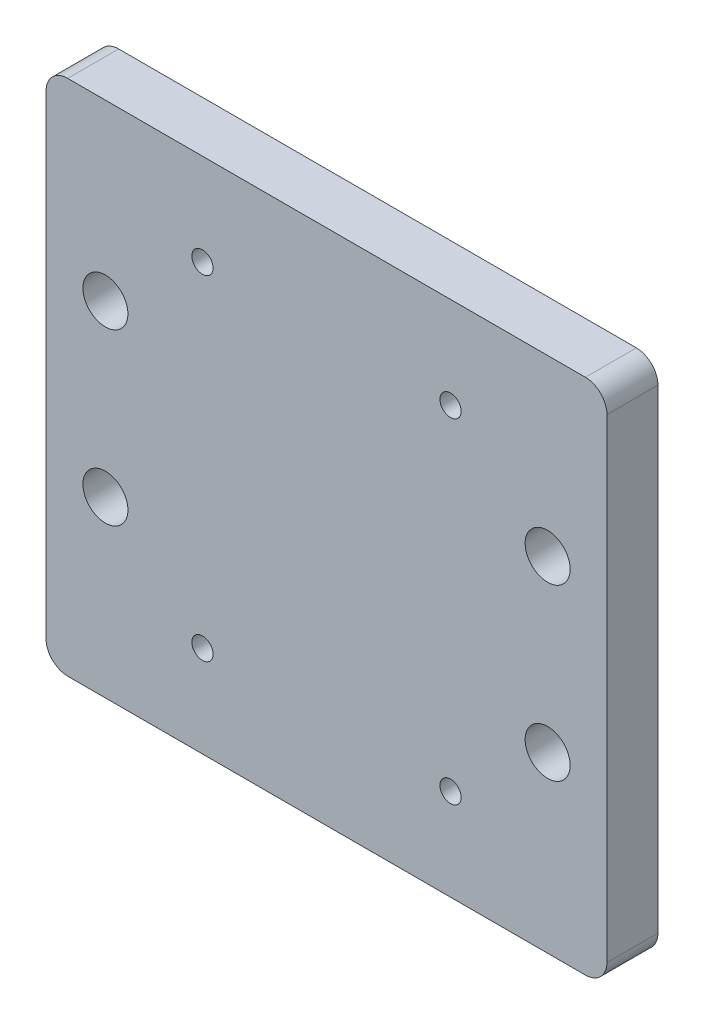
ISO-10303-21;
HEADER;
FILE_DESCRIPTION(('STEP AP214'),'2;1');
FILE_NAME('part.step','',(''),(''),'','','');
FILE_SCHEMA(('AUTOMOTIVE_DESIGN { 1 0 10303 214 1 1 1 1 }'));
ENDSEC;
DATA;
#1=APPLICATION_CONTEXT('core data for automotive mechanical design processes');
#2=APPLICATION_PROTOCOL_DEFINITION('international standard','automotive_design',2000,#1);
#3=PRODUCT_CONTEXT('',#1,'mechanical');
#4=PRODUCT('Part','Part','',(#3));
#5=PRODUCT_RELATED_PRODUCT_CATEGORY('part','',(#4));
#6=PRODUCT_DEFINITION_FORMATION('','',#4);
#7=PRODUCT_DEFINITION_CONTEXT('part definition',#1,'design');
#8=PRODUCT_DEFINITION('design','',#6,#7);
#9=PRODUCT_DEFINITION_SHAPE('','',#8);
#10=(LENGTH_UNIT() NAMED_UNIT(*) SI_UNIT(.MILLI.,.METRE.));
#11=(NAMED_UNIT(*) PLANE_ANGLE_UNIT() SI_UNIT($,.RADIAN.));
#12=(NAMED_UNIT(*) SI_UNIT($,.STERADIAN.) SOLID_ANGLE_UNIT());
#13=UNCERTAINTY_MEASURE_WITH_UNIT(LENGTH_MEASURE(1.E-05),#10,'distance_accuracy_value','');
#14=(GEOMETRIC_REPRESENTATION_CONTEXT(3) GLOBAL_UNCERTAINTY_ASSIGNED_CONTEXT((#13)) GLOBAL_UNIT_ASSIGNED_CONTEXT((#10,
#11,#12)) REPRESENTATION_CONTEXT('',''));
#15=CARTESIAN_POINT('',(0.,0.,0.));
#16=DIRECTION('',(0.,0.,1.));
#17=DIRECTION('',(1.,0.,0.));
#18=AXIS2_PLACEMENT_3D('',#15,#16,#17);
#19=CARTESIAN_POINT('',(465.1121,431.5714,-11.9999998759984));
#20=DIRECTION('',(0.,0.,1.));
#21=DIRECTION('',(0.,-1.,0.));
#22=AXIS2_PLACEMENT_3D('',#19,#20,#21);
#23=PLANE('',#22);
#24=CARTESIAN_POINT('',(469.5571,393.631400061,-11.9999998759984));
#25=DIRECTION('',(0.,0.,-1.));
#26=DIRECTION('',(-1.,0.,0.));
#27=AXIS2_PLACEMENT_3D('',#24,#25,#26);
#28=CIRCLE('',#27,2.64999999999999);
#29=CARTESIAN_POINT('',(466.9071,393.631400061,-11.9999998759984));
#30=VERTEX_POINT('',#29);
#31=EDGE_CURVE('E196',#30,#30,#28,.T.);
#32=ORIENTED_EDGE('',*,*,#31,.T.);
#33=EDGE_LOOP('',(#32));
#34=FACE_BOUND('',#33,.T.);
#35=CARTESIAN_POINT('',(469.5571,413.631399939,-11.9999998759984));
#36=DIRECTION('',(0.,0.,-1.));
#37=DIRECTION('',(-1.,0.,0.));
#38=AXIS2_PLACEMENT_3D('',#35,#36,#37);
#39=CIRCLE('',#38,2.64999999999999);
#40=CARTESIAN_POINT('',(466.9071,413.631399939,-11.9999998759984));
#41=VERTEX_POINT('',#40);
#42=EDGE_CURVE('E147',#41,#41,#39,.T.);
#43=ORIENTED_EDGE('',*,*,#42,.T.);
#44=EDGE_LOOP('',(#43));
#45=FACE_BOUND('',#44,.T.);
#46=CARTESIAN_POINT('',(465.1121,431.5714,-11.9999998759984));
#47=DIRECTION('',(0.,0.,-1.));
#48=DIRECTION('',(0.,-1.,0.));
#49=AXIS2_PLACEMENT_3D('',#46,#47,#48);
#50=CIRCLE('',#49,2.54000000000004);
#51=CARTESIAN_POINT('',(462.5721,431.5714,-11.9999998759984));
#52=VERTEX_POINT('',#51);
#53=CARTESIAN_POINT('',(465.1121,434.1114,-11.9999998759984));
#54=VERTEX_POINT('',#53);
#55=EDGE_CURVE('E143',#52,#54,#50,.T.);
#56=ORIENTED_EDGE('',*,*,#55,.F.);
#57=DIRECTION('',(0.,1.,0.));
#58=VECTOR('',#57,1.);
#59=CARTESIAN_POINT('',(462.5721,431.5714,-11.9999998759984));
#60=LINE('',#59,#58);
#61=CARTESIAN_POINT('',(462.5721,375.6914,-11.9999998759986));
#62=VERTEX_POINT('',#61);
#63=EDGE_CURVE('E97',#62,#52,#60,.T.);
#64=ORIENTED_EDGE('',*,*,#63,.F.);
#65=CARTESIAN_POINT('',(465.1121,375.6914,-11.9999998759986));
#66=DIRECTION('',(0.,0.,-1.));
#67=DIRECTION('',(0.,1.,0.));
#68=AXIS2_PLACEMENT_3D('',#65,#66,#67);
#69=CIRCLE('',#68,2.54000000000004);
#70=CARTESIAN_POINT('',(465.1121,373.1514,-11.9999998759986));
#71=VERTEX_POINT('',#70);
#72=EDGE_CURVE('E91',#71,#62,#69,.T.);
#73=ORIENTED_EDGE('',*,*,#72,.F.);
#74=DIRECTION('',(-1.,0.,0.));
#75=VECTOR('',#74,1.);
#76=CARTESIAN_POINT('',(526.0721,373.1514,-11.9999998759986));
#77=LINE('',#76,#75);
#78=CARTESIAN_POINT('',(526.0721,373.1514,-11.9999998759986));
#79=VERTEX_POINT('',#78);
#80=EDGE_CURVE('E133',#79,#71,#77,.T.);
#81=ORIENTED_EDGE('',*,*,#80,.F.);
#82=CARTESIAN_POINT('',(526.0721,375.6914,-11.9999998759986));
#83=DIRECTION('',(0.,0.,-1.));
#84=DIRECTION('',(0.,1.,0.));
#85=AXIS2_PLACEMENT_3D('',#82,#83,#84);
#86=CIRCLE('',#85,2.54000000000004);
#87=CARTESIAN_POINT('',(528.6121,375.6914,-11.9999998759986));
#88=VERTEX_POINT('',#87);
#89=EDGE_CURVE('E153',#88,#79,#86,.T.);
#90=ORIENTED_EDGE('',*,*,#89,.F.);
#91=DIRECTION('',(0.,-1.,0.));
#92=VECTOR('',#91,1.);
#93=CARTESIAN_POINT('',(528.6121,431.5714,-11.9999998759984));
#94=LINE('',#93,#92);
#95=CARTESIAN_POINT('',(528.6121,431.5714,-11.9999998759984));
#96=VERTEX_POINT('',#95);
#97=EDGE_CURVE('E151',#96,#88,#94,.T.);
#98=ORIENTED_EDGE('',*,*,#97,.F.);
#99=CARTESIAN_POINT('',(526.0721,431.5714,-11.9999998759984));
#100=DIRECTION('',(0.,0.,-1.));
#101=DIRECTION('',(0.,1.,0.));
#102=AXIS2_PLACEMENT_3D('',#99,#100,#101);
#103=CIRCLE('',#102,2.54000000000004);
#104=CARTESIAN_POINT('',(526.0721,434.1114,-11.9999998759984));
#105=VERTEX_POINT('',#104);
#106=EDGE_CURVE('E149',#105,#96,#103,.T.);
#107=ORIENTED_EDGE('',*,*,#106,.F.);
#108=DIRECTION('',(1.,0.,0.));
#109=VECTOR('',#108,1.);
#110=CARTESIAN_POINT('',(526.0721,434.1114,-11.9999998759984));
#111=LINE('',#110,#109);
#112=EDGE_CURVE('E146',#54,#105,#111,.T.);
#113=ORIENTED_EDGE('',*,*,#112,.F.);
#114=EDGE_LOOP('',(#56,#64,#73,#81,#90,#98,#107,#113));
#115=FACE_BOUND('',#114,.T.);
#116=CARTESIAN_POINT('',(521.6271,393.631400061,-11.9999998759984));
#117=DIRECTION('',(0.,0.,-1.));
#118=DIRECTION('',(-1.,0.,0.));
#119=AXIS2_PLACEMENT_3D('',#116,#117,#118);
#120=CIRCLE('',#119,2.65000000000004);
#121=CARTESIAN_POINT('',(518.9771,393.631400061,-11.9999998759984));
#122=VERTEX_POINT('',#121);
#123=EDGE_CURVE('E202',#122,#122,#120,.T.);
#124=ORIENTED_EDGE('',*,*,#123,.T.);
#125=EDGE_LOOP('',(#124));
#126=FACE_BOUND('',#125,.T.);
#127=CARTESIAN_POINT('',(521.6271,413.631399939,-11.9999998759984));
#128=DIRECTION('',(0.,0.,-1.));
#129=DIRECTION('',(-1.,0.,0.));
#130=AXIS2_PLACEMENT_3D('',#127,#128,#129);
#131=CIRCLE('',#130,2.65000000000004);
#132=CARTESIAN_POINT('',(518.9771,413.631399939,-11.9999998759984));
#133=VERTEX_POINT('',#132);
#134=EDGE_CURVE('E208',#133,#133,#131,.T.);
#135=ORIENTED_EDGE('',*,*,#134,.T.);
#136=EDGE_LOOP('',(#135));
#137=FACE_BOUND('',#136,.T.);
#138=CARTESIAN_POINT('',(510.1971,383.9464,-11.9999998759984));
#139=DIRECTION('',(0.,0.,-1.));
#140=DIRECTION('',(-1.,0.,0.));
#141=AXIS2_PLACEMENT_3D('',#138,#139,#140);
#142=CIRCLE('',#141,1.24999999999997);
#143=CARTESIAN_POINT('',(508.9471,383.9464,-11.9999998759984));
#144=VERTEX_POINT('',#143);
#145=EDGE_CURVE('E214',#144,#144,#142,.T.);
#146=ORIENTED_EDGE('',*,*,#145,.T.);
#147=EDGE_LOOP('',(#146));
#148=FACE_BOUND('',#147,.T.);
#149=CARTESIAN_POINT('',(480.9871,383.9464,-11.9999998759984));
#150=DIRECTION('',(0.,0.,-1.));
#151=DIRECTION('',(-1.,0.,0.));
#152=AXIS2_PLACEMENT_3D('',#149,#150,#151);
#153=CIRCLE('',#152,1.24999999999997);
#154=CARTESIAN_POINT('',(479.7371,383.9464,-11.9999998759984));
#155=VERTEX_POINT('',#154);
#156=EDGE_CURVE('E220',#155,#155,#153,.T.);
#157=ORIENTED_EDGE('',*,*,#156,.T.);
#158=EDGE_LOOP('',(#157));
#159=FACE_BOUND('',#158,.T.);
#160=CARTESIAN_POINT('',(480.9871,423.3164,-11.9999998759984));
#161=DIRECTION('',(0.,0.,-1.));
#162=DIRECTION('',(-1.,0.,0.));
#163=AXIS2_PLACEMENT_3D('',#160,#161,#162);
#164=CIRCLE('',#163,1.24999999999997);
#165=CARTESIAN_POINT('',(479.7371,423.3164,-11.9999998759984));
#166=VERTEX_POINT('',#165);
#167=EDGE_CURVE('E226',#166,#166,#164,.T.);
#168=ORIENTED_EDGE('',*,*,#167,.T.);
#169=EDGE_LOOP('',(#168));
#170=FACE_BOUND('',#169,.T.);
#171=CARTESIAN_POINT('',(510.1971,423.3164,-11.9999998759984));
#172=DIRECTION('',(0.,0.,-1.));
#173=DIRECTION('',(-1.,0.,0.));
#174=AXIS2_PLACEMENT_3D('',#171,#172,#173);
#175=CIRCLE('',#174,1.24999999999997);
#176=CARTESIAN_POINT('',(508.9471,423.3164,-11.9999998759984));
#177=VERTEX_POINT('',#176);
#178=EDGE_CURVE('E232',#177,#177,#175,.T.);
#179=ORIENTED_EDGE('',*,*,#178,.T.);
#180=EDGE_LOOP('',(#179));
#181=FACE_BOUND('',#180,.T.);
#182=ADVANCED_FACE('F45',(#34,#45,#115,#126,#137,#148,#159,#170,#181),#23,.T.);
#183=CARTESIAN_POINT('',(465.1121,431.5714,-17.9999998759984));
#184=DIRECTION('',(0.,0.,1.));
#185=DIRECTION('',(0.,-1.,0.));
#186=AXIS2_PLACEMENT_3D('',#183,#184,#185);
#187=PLANE('',#186);
#188=CARTESIAN_POINT('',(510.1971,423.3164,-17.999999876));
#189=DIRECTION('',(0.,0.,-1.));
#190=DIRECTION('',(-1.,0.,0.));
#191=AXIS2_PLACEMENT_3D('',#188,#189,#190);
#192=CIRCLE('',#191,1.24999999999997);
#193=CARTESIAN_POINT('',(508.9471,423.3164,-17.999999876));
#194=VERTEX_POINT('',#193);
#195=EDGE_CURVE('E235',#194,#194,#192,.T.);
#196=ORIENTED_EDGE('',*,*,#195,.F.);
#197=EDGE_LOOP('',(#196));
#198=FACE_BOUND('',#197,.T.);
#199=CARTESIAN_POINT('',(480.9871,423.3164,-17.999999876));
#200=DIRECTION('',(0.,0.,-1.));
#201=DIRECTION('',(-1.,0.,0.));
#202=AXIS2_PLACEMENT_3D('',#199,#200,#201);
#203=CIRCLE('',#202,1.24999999999997);
#204=CARTESIAN_POINT('',(479.7371,423.3164,-17.999999876));
#205=VERTEX_POINT('',#204);
#206=EDGE_CURVE('E229',#205,#205,#203,.T.);
#207=ORIENTED_EDGE('',*,*,#206,.F.);
#208=EDGE_LOOP('',(#207));
#209=FACE_BOUND('',#208,.T.);
#210=CARTESIAN_POINT('',(480.9871,383.9464,-17.999999876));
#211=DIRECTION('',(0.,0.,-1.));
#212=DIRECTION('',(-1.,0.,0.));
#213=AXIS2_PLACEMENT_3D('',#210,#211,#212);
#214=CIRCLE('',#213,1.24999999999997);
#215=CARTESIAN_POINT('',(479.7371,383.9464,-17.999999876));
#216=VERTEX_POINT('',#215);
#217=EDGE_CURVE('E223',#216,#216,#214,.T.);
#218=ORIENTED_EDGE('',*,*,#217,.F.);
#219=EDGE_LOOP('',(#218));
#220=FACE_BOUND('',#219,.T.);
#221=CARTESIAN_POINT('',(521.6271,413.631399939,-17.999999876));
#222=DIRECTION('',(0.,0.,-1.));
#223=DIRECTION('',(-1.,0.,0.));
#224=AXIS2_PLACEMENT_3D('',#221,#222,#223);
#225=CIRCLE('',#224,2.65000000000004);
#226=CARTESIAN_POINT('',(518.9771,413.631399939,-17.999999876));
#227=VERTEX_POINT('',#226);
#228=EDGE_CURVE('E211',#227,#227,#225,.T.);
#229=ORIENTED_EDGE('',*,*,#228,.F.);
#230=EDGE_LOOP('',(#229));
#231=FACE_BOUND('',#230,.T.);
#232=CARTESIAN_POINT('',(521.6271,393.631400061,-17.999999876));
#233=DIRECTION('',(0.,0.,-1.));
#234=DIRECTION('',(-1.,0.,0.));
#235=AXIS2_PLACEMENT_3D('',#232,#233,#234);
#236=CIRCLE('',#235,2.65000000000004);
#237=CARTESIAN_POINT('',(518.9771,393.631400061,-17.999999876));
#238=VERTEX_POINT('',#237);
#239=EDGE_CURVE('E205',#238,#238,#236,.T.);
#240=ORIENTED_EDGE('',*,*,#239,.F.);
#241=EDGE_LOOP('',(#240));
#242=FACE_BOUND('',#241,.T.);
#243=CARTESIAN_POINT('',(469.5571,393.631400061,-17.999999876));
#244=DIRECTION('',(0.,0.,-1.));
#245=DIRECTION('',(-1.,0.,0.));
#246=AXIS2_PLACEMENT_3D('',#243,#244,#245);
#247=CIRCLE('',#246,2.64999999999999);
#248=CARTESIAN_POINT('',(466.9071,393.631400061,-17.999999876));
#249=VERTEX_POINT('',#248);
#250=EDGE_CURVE('E199',#249,#249,#247,.T.);
#251=ORIENTED_EDGE('',*,*,#250,.F.);
#252=EDGE_LOOP('',(#251));
#253=FACE_BOUND('',#252,.T.);
#254=CARTESIAN_POINT('',(469.5571,413.631399939,-17.999999876));
#255=DIRECTION('',(0.,0.,-1.));
#256=DIRECTION('',(-1.,0.,0.));
#257=AXIS2_PLACEMENT_3D('',#254,#255,#256);
#258=CIRCLE('',#257,2.64999999999999);
#259=CARTESIAN_POINT('',(466.9071,413.631399939,-17.999999876));
#260=VERTEX_POINT('',#259);
#261=EDGE_CURVE('E193',#260,#260,#258,.T.);
#262=ORIENTED_EDGE('',*,*,#261,.F.);
#263=EDGE_LOOP('',(#262));
#264=FACE_BOUND('',#263,.T.);
#265=CARTESIAN_POINT('',(465.1121,431.5714,-17.9999998759984));
#266=DIRECTION('',(0.,0.,-1.));
#267=DIRECTION('',(0.,-1.,0.));
#268=AXIS2_PLACEMENT_3D('',#265,#266,#267);
#269=CIRCLE('',#268,2.54000000000004);
#270=CARTESIAN_POINT('',(462.5721,431.5714,-17.9999998759984));
#271=VERTEX_POINT('',#270);
#272=CARTESIAN_POINT('',(465.1121,434.1114,-17.9999998759984));
#273=VERTEX_POINT('',#272);
#274=EDGE_CURVE('E158',#271,#273,#269,.T.);
#275=ORIENTED_EDGE('',*,*,#274,.T.);
#276=DIRECTION('',(1.,0.,0.));
#277=VECTOR('',#276,1.);
#278=CARTESIAN_POINT('',(526.0721,434.1114,-17.9999998759984));
#279=LINE('',#278,#277);
#280=CARTESIAN_POINT('',(526.0721,434.1114,-17.9999998759984));
#281=VERTEX_POINT('',#280);
#282=EDGE_CURVE('E105',#273,#281,#279,.T.);
#283=ORIENTED_EDGE('',*,*,#282,.T.);
#284=CARTESIAN_POINT('',(526.0721,431.5714,-17.9999998759984));
#285=DIRECTION('',(0.,0.,-1.));
#286=DIRECTION('',(0.,1.,0.));
#287=AXIS2_PLACEMENT_3D('',#284,#285,#286);
#288=CIRCLE('',#287,2.54000000000004);
#289=CARTESIAN_POINT('',(528.6121,431.5714,-17.9999998759984));
#290=VERTEX_POINT('',#289);
#291=EDGE_CURVE('E173',#281,#290,#288,.T.);
#292=ORIENTED_EDGE('',*,*,#291,.T.);
#293=DIRECTION('',(0.,-1.,0.));
#294=VECTOR('',#293,1.);
#295=CARTESIAN_POINT('',(528.6121,431.5714,-17.9999998759984));
#296=LINE('',#295,#294);
#297=CARTESIAN_POINT('',(528.6121,375.6914,-17.9999998759986));
#298=VERTEX_POINT('',#297);
#299=EDGE_CURVE('E185',#290,#298,#296,.T.);
#300=ORIENTED_EDGE('',*,*,#299,.T.);
#301=CARTESIAN_POINT('',(526.0721,375.6914,-17.9999998759986));
#302=DIRECTION('',(0.,0.,-1.));
#303=DIRECTION('',(0.,1.,0.));
#304=AXIS2_PLACEMENT_3D('',#301,#302,#303);
#305=CIRCLE('',#304,2.54000000000004);
#306=CARTESIAN_POINT('',(526.0721,373.1514,-17.9999998759986));
#307=VERTEX_POINT('',#306);
#308=EDGE_CURVE('E125',#298,#307,#305,.T.);
#309=ORIENTED_EDGE('',*,*,#308,.T.);
#310=DIRECTION('',(-1.,0.,0.));
#311=VECTOR('',#310,1.);
#312=CARTESIAN_POINT('',(526.0721,373.1514,-17.9999998759986));
#313=LINE('',#312,#311);
#314=CARTESIAN_POINT('',(465.1121,373.1514,-17.9999998759986));
#315=VERTEX_POINT('',#314);
#316=EDGE_CURVE('E118',#307,#315,#313,.T.);
#317=ORIENTED_EDGE('',*,*,#316,.T.);
#318=CARTESIAN_POINT('',(465.1121,375.6914,-17.9999998759986));
#319=DIRECTION('',(0.,0.,-1.));
#320=DIRECTION('',(0.,1.,0.));
#321=AXIS2_PLACEMENT_3D('',#318,#319,#320);
#322=CIRCLE('',#321,2.54000000000004);
#323=CARTESIAN_POINT('',(462.5721,375.6914,-17.9999998759986));
#324=VERTEX_POINT('',#323);
#325=EDGE_CURVE('E123',#315,#324,#322,.T.);
#326=ORIENTED_EDGE('',*,*,#325,.T.);
#327=DIRECTION('',(0.,1.,0.));
#328=VECTOR('',#327,1.);
#329=CARTESIAN_POINT('',(462.5721,431.5714,-17.9999998759984));
#330=LINE('',#329,#328);
#331=EDGE_CURVE('E62',#324,#271,#330,.T.);
#332=ORIENTED_EDGE('',*,*,#331,.T.);
#333=EDGE_LOOP('',(#275,#283,#292,#300,#309,#317,#326,#332));
#334=FACE_BOUND('',#333,.T.);
#335=CARTESIAN_POINT('',(510.1971,383.9464,-17.999999876));
#336=DIRECTION('',(0.,0.,-1.));
#337=DIRECTION('',(-1.,0.,0.));
#338=AXIS2_PLACEMENT_3D('',#335,#336,#337);
#339=CIRCLE('',#338,1.24999999999997);
#340=CARTESIAN_POINT('',(508.9471,383.9464,-17.999999876));
#341=VERTEX_POINT('',#340);
#342=EDGE_CURVE('E217',#341,#341,#339,.T.);
#343=ORIENTED_EDGE('',*,*,#342,.F.);
#344=EDGE_LOOP('',(#343));
#345=FACE_BOUND('',#344,.T.);
#346=ADVANCED_FACE('F120',(#198,#209,#220,#231,#242,#253,#264,#334,#345),#187,.F.);
#347=CARTESIAN_POINT('',(465.1121,431.5714,-17.9999998759984));
#348=DIRECTION('',(0.,0.,1.));
#349=DIRECTION('',(0.,-1.,0.));
#350=AXIS2_PLACEMENT_3D('',#347,#348,#349);
#351=CYLINDRICAL_SURFACE('',#350,2.54000000000004);
#352=ORIENTED_EDGE('',*,*,#55,.T.);
#353=DIRECTION('',(0.,0.,1.));
#354=VECTOR('',#353,1.);
#355=CARTESIAN_POINT('',(465.1121,434.1114,-17.9999998759984));
#356=LINE('',#355,#354);
#357=EDGE_CURVE('E11',#273,#54,#356,.T.);
#358=ORIENTED_EDGE('',*,*,#357,.F.);
#359=ORIENTED_EDGE('',*,*,#274,.F.);
#360=DIRECTION('',(0.,0.,1.));
#361=VECTOR('',#360,1.);
#362=CARTESIAN_POINT('',(462.5721,431.5714,-17.9999998759984));
#363=LINE('',#362,#361);
#364=EDGE_CURVE('E139',#271,#52,#363,.T.);
#365=ORIENTED_EDGE('',*,*,#364,.T.);
#366=EDGE_LOOP('',(#352,#358,#359,#365));
#367=FACE_BOUND('',#366,.T.);
#368=ADVANCED_FACE('F47',(#367),#351,.T.);
#369=CARTESIAN_POINT('',(526.0721,434.1114,-17.9999998759984));
#370=DIRECTION('',(0.,-1.,0.));
#371=DIRECTION('',(0.,0.,-1.));
#372=AXIS2_PLACEMENT_3D('',#369,#370,#371);
#373=PLANE('',#372);
#374=ORIENTED_EDGE('',*,*,#112,.T.);
#375=DIRECTION('',(0.,0.,1.));
#376=VECTOR('',#375,1.);
#377=CARTESIAN_POINT('',(526.0721,434.1114,-17.9999998759984));
#378=LINE('',#377,#376);
#379=EDGE_CURVE('E54',#281,#105,#378,.T.);
#380=ORIENTED_EDGE('',*,*,#379,.F.);
#381=ORIENTED_EDGE('',*,*,#282,.F.);
#382=ORIENTED_EDGE('',*,*,#357,.T.);
#383=EDGE_LOOP('',(#374,#380,#381,#382));
#384=FACE_BOUND('',#383,.T.);
#385=ADVANCED_FACE('F287',(#384),#373,.F.);
#386=CARTESIAN_POINT('',(526.0721,431.5714,-17.9999998759984));
#387=DIRECTION('',(0.,0.,1.));
#388=DIRECTION('',(0.,-1.,0.));
#389=AXIS2_PLACEMENT_3D('',#386,#387,#388);
#390=CYLINDRICAL_SURFACE('',#389,2.54000000000004);
#391=ORIENTED_EDGE('',*,*,#106,.T.);
#392=DIRECTION('',(0.,0.,1.));
#393=VECTOR('',#392,1.);
#394=CARTESIAN_POINT('',(528.6121,431.5714,-17.9999998759984));
#395=LINE('',#394,#393);
#396=EDGE_CURVE('E165',#290,#96,#395,.T.);
#397=ORIENTED_EDGE('',*,*,#396,.F.);
#398=ORIENTED_EDGE('',*,*,#291,.F.);
#399=ORIENTED_EDGE('',*,*,#379,.T.);
#400=EDGE_LOOP('',(#391,#397,#398,#399));
#401=FACE_BOUND('',#400,.T.);
#402=ADVANCED_FACE('F171',(#401),#390,.T.);
#403=CARTESIAN_POINT('',(528.6121,431.5714,-17.9999998759984));
#404=DIRECTION('',(-1.,0.,0.));
#405=DIRECTION('',(0.,0.,1.));
#406=AXIS2_PLACEMENT_3D('',#403,#404,#405);
#407=PLANE('',#406);
#408=ORIENTED_EDGE('',*,*,#97,.T.);
#409=DIRECTION('',(0.,0.,1.));
#410=VECTOR('',#409,1.);
#411=CARTESIAN_POINT('',(528.6121,375.6914,-17.9999998759986));
#412=LINE('',#411,#410);
#413=EDGE_CURVE('E162',#298,#88,#412,.T.);
#414=ORIENTED_EDGE('',*,*,#413,.F.);
#415=ORIENTED_EDGE('',*,*,#299,.F.);
#416=ORIENTED_EDGE('',*,*,#396,.T.);
#417=EDGE_LOOP('',(#408,#414,#415,#416));
#418=FACE_BOUND('',#417,.T.);
#419=ADVANCED_FACE('F181',(#418),#407,.F.);
#420=CARTESIAN_POINT('',(526.0721,375.6914,-17.9999998759986));
#421=DIRECTION('',(0.,0.,1.));
#422=DIRECTION('',(0.,-1.,0.));
#423=AXIS2_PLACEMENT_3D('',#420,#421,#422);
#424=CYLINDRICAL_SURFACE('',#423,2.54000000000004);
#425=ORIENTED_EDGE('',*,*,#89,.T.);
#426=DIRECTION('',(0.,0.,1.));
#427=VECTOR('',#426,1.);
#428=CARTESIAN_POINT('',(526.0721,373.1514,-17.9999998759986));
#429=LINE('',#428,#427);
#430=EDGE_CURVE('E134',#307,#79,#429,.T.);
#431=ORIENTED_EDGE('',*,*,#430,.F.);
#432=ORIENTED_EDGE('',*,*,#308,.F.);
#433=ORIENTED_EDGE('',*,*,#413,.T.);
#434=EDGE_LOOP('',(#425,#431,#432,#433));
#435=FACE_BOUND('',#434,.T.);
#436=ADVANCED_FACE('F184',(#435),#424,.T.);
#437=CARTESIAN_POINT('',(526.0721,373.1514,-17.9999998759986));
#438=DIRECTION('',(0.,1.,0.));
#439=DIRECTION('',(0.,0.,1.));
#440=AXIS2_PLACEMENT_3D('',#437,#438,#439);
#441=PLANE('',#440);
#442=ORIENTED_EDGE('',*,*,#80,.T.);
#443=DIRECTION('',(0.,0.,1.));
#444=VECTOR('',#443,1.);
#445=CARTESIAN_POINT('',(465.1121,373.1514,-17.9999998759986));
#446=LINE('',#445,#444);
#447=EDGE_CURVE('E130',#315,#71,#446,.T.);
#448=ORIENTED_EDGE('',*,*,#447,.F.);
#449=ORIENTED_EDGE('',*,*,#316,.F.);
#450=ORIENTED_EDGE('',*,*,#430,.T.);
#451=EDGE_LOOP('',(#442,#448,#449,#450));
#452=FACE_BOUND('',#451,.T.);
#453=ADVANCED_FACE('F131',(#452),#441,.F.);
#454=CARTESIAN_POINT('',(465.1121,375.6914,-17.9999998759986));
#455=DIRECTION('',(0.,0.,1.));
#456=DIRECTION('',(0.,-1.,0.));
#457=AXIS2_PLACEMENT_3D('',#454,#455,#456);
#458=CYLINDRICAL_SURFACE('',#457,2.54000000000004);
#459=ORIENTED_EDGE('',*,*,#72,.T.);
#460=DIRECTION('',(0.,0.,1.));
#461=VECTOR('',#460,1.);
#462=CARTESIAN_POINT('',(462.5721,375.6914,-17.9999998759986));
#463=LINE('',#462,#461);
#464=EDGE_CURVE('E135',#324,#62,#463,.T.);
#465=ORIENTED_EDGE('',*,*,#464,.F.);
#466=ORIENTED_EDGE('',*,*,#325,.F.);
#467=ORIENTED_EDGE('',*,*,#447,.T.);
#468=EDGE_LOOP('',(#459,#465,#466,#467));
#469=FACE_BOUND('',#468,.T.);
#470=ADVANCED_FACE('F137',(#469),#458,.T.);
#471=CARTESIAN_POINT('',(462.5721,431.5714,-17.9999998759984));
#472=DIRECTION('',(1.,0.,0.));
#473=DIRECTION('',(0.,0.,-1.));
#474=AXIS2_PLACEMENT_3D('',#471,#472,#473);
#475=PLANE('',#474);
#476=ORIENTED_EDGE('',*,*,#63,.T.);
#477=ORIENTED_EDGE('',*,*,#364,.F.);
#478=ORIENTED_EDGE('',*,*,#331,.F.);
#479=ORIENTED_EDGE('',*,*,#464,.T.);
#480=EDGE_LOOP('',(#476,#477,#478,#479));
#481=FACE_BOUND('',#480,.T.);
#482=ADVANCED_FACE('F260',(#481),#475,.F.);
#483=CARTESIAN_POINT('',(469.5571,413.631399939,-17.999999876));
#484=DIRECTION('',(0.,0.,-1.));
#485=DIRECTION('',(-1.,0.,0.));
#486=AXIS2_PLACEMENT_3D('',#483,#484,#485);
#487=CYLINDRICAL_SURFACE('',#486,2.64999999999999);
#488=ORIENTED_EDGE('',*,*,#42,.F.);
#489=EDGE_LOOP('',(#488));
#490=FACE_BOUND('',#489,.T.);
#491=ORIENTED_EDGE('',*,*,#261,.T.);
#492=EDGE_LOOP('',(#491));
#493=FACE_BOUND('',#492,.T.);
#494=ADVANCED_FACE('F257',(#490,#493),#487,.F.);
#495=CARTESIAN_POINT('',(469.5571,393.631400061,-17.999999876));
#496=DIRECTION('',(0.,0.,-1.));
#497=DIRECTION('',(-1.,0.,0.));
#498=AXIS2_PLACEMENT_3D('',#495,#496,#497);
#499=CYLINDRICAL_SURFACE('',#498,2.64999999999999);
#500=ORIENTED_EDGE('',*,*,#31,.F.);
#501=EDGE_LOOP('',(#500));
#502=FACE_BOUND('',#501,.T.);
#503=ORIENTED_EDGE('',*,*,#250,.T.);
#504=EDGE_LOOP('',(#503));
#505=FACE_BOUND('',#504,.T.);
#506=ADVANCED_FACE('F259',(#502,#505),#499,.F.);
#507=CARTESIAN_POINT('',(521.6271,393.631400061,-17.999999876));
#508=DIRECTION('',(0.,0.,-1.));
#509=DIRECTION('',(-1.,0.,0.));
#510=AXIS2_PLACEMENT_3D('',#507,#508,#509);
#511=CYLINDRICAL_SURFACE('',#510,2.65000000000004);
#512=ORIENTED_EDGE('',*,*,#123,.F.);
#513=EDGE_LOOP('',(#512));
#514=FACE_BOUND('',#513,.T.);
#515=ORIENTED_EDGE('',*,*,#239,.T.);
#516=EDGE_LOOP('',(#515));
#517=FACE_BOUND('',#516,.T.);
#518=ADVANCED_FACE('F267',(#514,#517),#511,.F.);
#519=CARTESIAN_POINT('',(521.6271,413.631399939,-17.999999876));
#520=DIRECTION('',(0.,0.,-1.));
#521=DIRECTION('',(-1.,0.,0.));
#522=AXIS2_PLACEMENT_3D('',#519,#520,#521);
#523=CYLINDRICAL_SURFACE('',#522,2.65000000000004);
#524=ORIENTED_EDGE('',*,*,#134,.F.);
#525=EDGE_LOOP('',(#524));
#526=FACE_BOUND('',#525,.T.);
#527=ORIENTED_EDGE('',*,*,#228,.T.);
#528=EDGE_LOOP('',(#527));
#529=FACE_BOUND('',#528,.T.);
#530=ADVANCED_FACE('F357',(#526,#529),#523,.F.);
#531=CARTESIAN_POINT('',(510.1971,383.9464,-17.999999876));
#532=DIRECTION('',(0.,0.,-1.));
#533=DIRECTION('',(-1.,0.,0.));
#534=AXIS2_PLACEMENT_3D('',#531,#532,#533);
#535=CYLINDRICAL_SURFACE('',#534,1.24999999999997);
#536=ORIENTED_EDGE('',*,*,#145,.F.);
#537=EDGE_LOOP('',(#536));
#538=FACE_BOUND('',#537,.T.);
#539=ORIENTED_EDGE('',*,*,#342,.T.);
#540=EDGE_LOOP('',(#539));
#541=FACE_BOUND('',#540,.T.);
#542=ADVANCED_FACE('F367',(#538,#541),#535,.F.);
#543=CARTESIAN_POINT('',(480.9871,383.9464,-17.999999876));
#544=DIRECTION('',(0.,0.,-1.));
#545=DIRECTION('',(-1.,0.,0.));
#546=AXIS2_PLACEMENT_3D('',#543,#544,#545);
#547=CYLINDRICAL_SURFACE('',#546,1.24999999999997);
#548=ORIENTED_EDGE('',*,*,#156,.F.);
#549=EDGE_LOOP('',(#548));
#550=FACE_BOUND('',#549,.T.);
#551=ORIENTED_EDGE('',*,*,#217,.T.);
#552=EDGE_LOOP('',(#551));
#553=FACE_BOUND('',#552,.T.);
#554=ADVANCED_FACE('F389',(#550,#553),#547,.F.);
#555=CARTESIAN_POINT('',(480.9871,423.3164,-17.999999876));
#556=DIRECTION('',(0.,0.,-1.));
#557=DIRECTION('',(-1.,0.,0.));
#558=AXIS2_PLACEMENT_3D('',#555,#556,#557);
#559=CYLINDRICAL_SURFACE('',#558,1.24999999999997);
#560=ORIENTED_EDGE('',*,*,#167,.F.);
#561=EDGE_LOOP('',(#560));
#562=FACE_BOUND('',#561,.T.);
#563=ORIENTED_EDGE('',*,*,#206,.T.);
#564=EDGE_LOOP('',(#563));
#565=FACE_BOUND('',#564,.T.);
#566=ADVANCED_FACE('F399',(#562,#565),#559,.F.);
#567=CARTESIAN_POINT('',(510.1971,423.3164,-17.999999876));
#568=DIRECTION('',(0.,0.,-1.));
#569=DIRECTION('',(-1.,0.,0.));
#570=AXIS2_PLACEMENT_3D('',#567,#568,#569);
#571=CYLINDRICAL_SURFACE('',#570,1.24999999999997);
#572=ORIENTED_EDGE('',*,*,#178,.F.);
#573=EDGE_LOOP('',(#572));
#574=FACE_BOUND('',#573,.T.);
#575=ORIENTED_EDGE('',*,*,#195,.T.);
#576=EDGE_LOOP('',(#575));
#577=FACE_BOUND('',#576,.T.);
#578=ADVANCED_FACE('F240',(#574,#577),#571,.F.);
#579=CLOSED_SHELL('',(#182,#346,#368,#385,#402,#419,#436,#453,#470,#482,#494,#506,#518,#530,
#542,#554,#566,#578));
#580=MANIFOLD_SOLID_BREP('B2',#579);
#581=ADVANCED_BREP_SHAPE_REPRESENTATION('',(#18,#580),#14);
#582=SHAPE_DEFINITION_REPRESENTATION(#9,#581);
ENDSEC;
END-ISO-10303-21;
